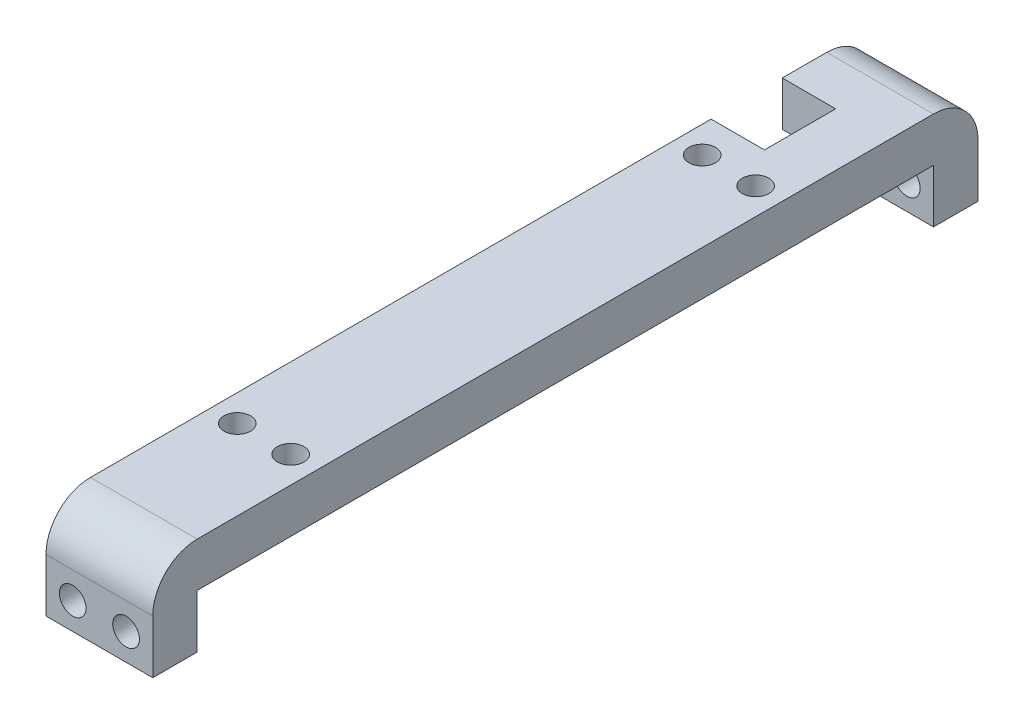
ISO-10303-21;
HEADER;
FILE_DESCRIPTION(('STEP AP214'),'2;1');
FILE_NAME('part.step','',(''),(''),'','','');
FILE_SCHEMA(('AUTOMOTIVE_DESIGN { 1 0 10303 214 1 1 1 1 }'));
ENDSEC;
DATA;
#1=APPLICATION_CONTEXT('core data for automotive mechanical design processes');
#2=APPLICATION_PROTOCOL_DEFINITION('international standard','automotive_design',2000,#1);
#3=PRODUCT_CONTEXT('',#1,'mechanical');
#4=PRODUCT('Part','Part','',(#3));
#5=PRODUCT_RELATED_PRODUCT_CATEGORY('part','',(#4));
#6=PRODUCT_DEFINITION_FORMATION('','',#4);
#7=PRODUCT_DEFINITION_CONTEXT('part definition',#1,'design');
#8=PRODUCT_DEFINITION('design','',#6,#7);
#9=PRODUCT_DEFINITION_SHAPE('','',#8);
#10=(LENGTH_UNIT() NAMED_UNIT(*) SI_UNIT(.MILLI.,.METRE.));
#11=(NAMED_UNIT(*) PLANE_ANGLE_UNIT() SI_UNIT($,.RADIAN.));
#12=(NAMED_UNIT(*) SI_UNIT($,.STERADIAN.) SOLID_ANGLE_UNIT());
#13=UNCERTAINTY_MEASURE_WITH_UNIT(LENGTH_MEASURE(1.E-05),#10,'distance_accuracy_value','');
#14=(GEOMETRIC_REPRESENTATION_CONTEXT(3) GLOBAL_UNCERTAINTY_ASSIGNED_CONTEXT((#13)) GLOBAL_UNIT_ASSIGNED_CONTEXT((#10,
#11,#12)) REPRESENTATION_CONTEXT('',''));
#15=CARTESIAN_POINT('',(0.,0.,0.));
#16=DIRECTION('',(0.,0.,1.));
#17=DIRECTION('',(1.,0.,0.));
#18=AXIS2_PLACEMENT_3D('',#15,#16,#17);
#19=CARTESIAN_POINT('',(-6.,5.5,5.));
#20=DIRECTION('',(1.,0.,0.));
#21=DIRECTION('',(0.,1.,0.));
#22=AXIS2_PLACEMENT_3D('',#19,#20,#21);
#23=PLANE('',#22);
#24=DIRECTION('',(0.,0.,-1.));
#25=VECTOR('',#24,1.);
#26=CARTESIAN_POINT('',(-6.,5.5,5.));
#27=LINE('',#26,#25);
#28=CARTESIAN_POINT('',(-6.,5.5,9.99999999999999));
#29=VERTEX_POINT('',#28);
#30=CARTESIAN_POINT('',(-6.,5.5,5.));
#31=VERTEX_POINT('',#30);
#32=EDGE_CURVE('E143',#29,#31,#27,.T.);
#33=ORIENTED_EDGE('',*,*,#32,.T.);
#34=CARTESIAN_POINT('',(-6.,0.5,5.));
#35=DIRECTION('',(1.,0.,0.));
#36=DIRECTION('',(0.,1.,0.));
#37=AXIS2_PLACEMENT_3D('',#34,#35,#36);
#38=CIRCLE('',#37,5.);
#39=CARTESIAN_POINT('',(-6.,0.5,0.));
#40=VERTEX_POINT('',#39);
#41=EDGE_CURVE('E40',#31,#40,#38,.F.);
#42=ORIENTED_EDGE('',*,*,#41,.T.);
#43=DIRECTION('',(0.,-1.,0.));
#44=VECTOR('',#43,1.);
#45=CARTESIAN_POINT('',(-6.,5.5,0.));
#46=LINE('',#45,#44);
#47=CARTESIAN_POINT('',(-6.,-5.5,0.));
#48=VERTEX_POINT('',#47);
#49=EDGE_CURVE('E271',#40,#48,#46,.T.);
#50=ORIENTED_EDGE('',*,*,#49,.T.);
#51=DIRECTION('',(0.,0.,-1.));
#52=VECTOR('',#51,1.);
#53=CARTESIAN_POINT('',(-6.,-5.5,5.));
#54=LINE('',#53,#52);
#55=CARTESIAN_POINT('',(-6.,-5.5,5.));
#56=VERTEX_POINT('',#55);
#57=EDGE_CURVE('E259',#56,#48,#54,.T.);
#58=ORIENTED_EDGE('',*,*,#57,.F.);
#59=DIRECTION('',(0.,-1.,0.));
#60=VECTOR('',#59,1.);
#61=CARTESIAN_POINT('',(-6.,5.5,5.));
#62=LINE('',#61,#60);
#63=CARTESIAN_POINT('',(-6.,0.5,5.));
#64=VERTEX_POINT('',#63);
#65=EDGE_CURVE('E256',#64,#56,#62,.T.);
#66=ORIENTED_EDGE('',*,*,#65,.F.);
#67=DIRECTION('',(0.,0.,-1.));
#68=VECTOR('',#67,1.);
#69=CARTESIAN_POINT('',(-6.,0.5,87.76));
#70=LINE('',#69,#68);
#71=CARTESIAN_POINT('',(-6.,0.499999999999999,9.99999999999999));
#72=VERTEX_POINT('',#71);
#73=EDGE_CURVE('E276',#72,#64,#70,.T.);
#74=ORIENTED_EDGE('',*,*,#73,.F.);
#75=DIRECTION('',(0.,1.,0.));
#76=VECTOR('',#75,1.);
#77=CARTESIAN_POINT('',(-6.,-9.5,9.99999999999999));
#78=LINE('',#77,#76);
#79=EDGE_CURVE('E170',#72,#29,#78,.T.);
#80=ORIENTED_EDGE('',*,*,#79,.T.);
#81=EDGE_LOOP('',(#33,#42,#50,#58,#66,#74,#80));
#82=FACE_BOUND('',#81,.T.);
#83=ADVANCED_FACE('F32',(#82),#23,.F.);
#84=DIRECTION('',(0.,-1.,0.));
#85=VECTOR('',#84,1.);
#86=CARTESIAN_POINT('',(-6.,5.5,92.76));
#87=LINE('',#86,#85);
#88=CARTESIAN_POINT('',(-6.,0.5,92.76));
#89=VERTEX_POINT('',#88);
#90=CARTESIAN_POINT('',(-6.,-5.5,92.76));
#91=VERTEX_POINT('',#90);
#92=EDGE_CURVE('E203',#89,#91,#87,.T.);
#93=ORIENTED_EDGE('',*,*,#92,.F.);
#94=CARTESIAN_POINT('',(-6.,0.5,87.76));
#95=DIRECTION('',(1.,0.,0.));
#96=DIRECTION('',(0.,1.,0.));
#97=AXIS2_PLACEMENT_3D('',#94,#95,#96);
#98=CIRCLE('',#97,5.);
#99=CARTESIAN_POINT('',(-6.,5.5,87.76));
#100=VERTEX_POINT('',#99);
#101=EDGE_CURVE('E138',#89,#100,#98,.F.);
#102=ORIENTED_EDGE('',*,*,#101,.T.);
#103=CARTESIAN_POINT('',(-6.,5.5,18.));
#104=VERTEX_POINT('',#103);
#105=EDGE_CURVE('E131',#100,#104,#27,.T.);
#106=ORIENTED_EDGE('',*,*,#105,.T.);
#107=DIRECTION('',(0.,1.,0.));
#108=VECTOR('',#107,1.);
#109=CARTESIAN_POINT('',(-6.,-9.5,18.));
#110=LINE('',#109,#108);
#111=CARTESIAN_POINT('',(-6.,0.499999999999999,18.));
#112=VERTEX_POINT('',#111);
#113=EDGE_CURVE('E136',#112,#104,#110,.T.);
#114=ORIENTED_EDGE('',*,*,#113,.F.);
#115=CARTESIAN_POINT('',(-6.,0.5,87.76));
#116=VERTEX_POINT('',#115);
#117=EDGE_CURVE('E272',#116,#112,#70,.T.);
#118=ORIENTED_EDGE('',*,*,#117,.F.);
#119=DIRECTION('',(0.,-1.,0.));
#120=VECTOR('',#119,1.);
#121=CARTESIAN_POINT('',(-6.,5.5,87.76));
#122=LINE('',#121,#120);
#123=CARTESIAN_POINT('',(-6.,-5.5,87.76));
#124=VERTEX_POINT('',#123);
#125=EDGE_CURVE('E202',#116,#124,#122,.T.);
#126=ORIENTED_EDGE('',*,*,#125,.T.);
#127=DIRECTION('',(0.,0.,-1.));
#128=VECTOR('',#127,1.);
#129=CARTESIAN_POINT('',(-6.,-5.5,92.76));
#130=LINE('',#129,#128);
#131=EDGE_CURVE('E219',#91,#124,#130,.T.);
#132=ORIENTED_EDGE('',*,*,#131,.F.);
#133=EDGE_LOOP('',(#93,#102,#106,#114,#118,#126,#132));
#134=FACE_BOUND('',#133,.T.);
#135=ADVANCED_FACE('F134',(#134),#23,.F.);
#136=CARTESIAN_POINT('',(-6.,-5.5,5.));
#137=DIRECTION('',(0.,1.,0.));
#138=DIRECTION('',(0.,0.,1.));
#139=AXIS2_PLACEMENT_3D('',#136,#137,#138);
#140=PLANE('',#139);
#141=DIRECTION('',(1.,0.,0.));
#142=VECTOR('',#141,1.);
#143=CARTESIAN_POINT('',(-6.,-5.5,0.));
#144=LINE('',#143,#142);
#145=CARTESIAN_POINT('',(6.,-5.5,0.));
#146=VERTEX_POINT('',#145);
#147=EDGE_CURVE('E269',#48,#146,#144,.T.);
#148=ORIENTED_EDGE('',*,*,#147,.T.);
#149=DIRECTION('',(0.,0.,-1.));
#150=VECTOR('',#149,1.);
#151=CARTESIAN_POINT('',(6.,-5.5,5.));
#152=LINE('',#151,#150);
#153=CARTESIAN_POINT('',(6.,-5.5,5.));
#154=VERTEX_POINT('',#153);
#155=EDGE_CURVE('E263',#154,#146,#152,.T.);
#156=ORIENTED_EDGE('',*,*,#155,.F.);
#157=DIRECTION('',(1.,0.,0.));
#158=VECTOR('',#157,1.);
#159=CARTESIAN_POINT('',(-6.,-5.5,5.));
#160=LINE('',#159,#158);
#161=EDGE_CURVE('E255',#56,#154,#160,.T.);
#162=ORIENTED_EDGE('',*,*,#161,.F.);
#163=ORIENTED_EDGE('',*,*,#57,.T.);
#164=EDGE_LOOP('',(#148,#156,#162,#163));
#165=FACE_BOUND('',#164,.T.);
#166=ADVANCED_FACE('F312',(#165),#140,.F.);
#167=CARTESIAN_POINT('',(6.,5.5,5.));
#168=DIRECTION('',(-1.,0.,0.));
#169=DIRECTION('',(0.,0.,1.));
#170=AXIS2_PLACEMENT_3D('',#167,#168,#169);
#171=PLANE('',#170);
#172=DIRECTION('',(0.,0.,-1.));
#173=VECTOR('',#172,1.);
#174=CARTESIAN_POINT('',(6.,5.5,5.));
#175=LINE('',#174,#173);
#176=CARTESIAN_POINT('',(6.,5.5,87.76));
#177=VERTEX_POINT('',#176);
#178=CARTESIAN_POINT('',(6.,5.5,5.));
#179=VERTEX_POINT('',#178);
#180=EDGE_CURVE('E142',#177,#179,#175,.T.);
#181=ORIENTED_EDGE('',*,*,#180,.F.);
#182=CARTESIAN_POINT('',(6.,0.5,87.76));
#183=DIRECTION('',(-1.,0.,0.));
#184=DIRECTION('',(0.,0.,1.));
#185=AXIS2_PLACEMENT_3D('',#182,#183,#184);
#186=CIRCLE('',#185,5.);
#187=CARTESIAN_POINT('',(6.,0.5,92.76));
#188=VERTEX_POINT('',#187);
#189=EDGE_CURVE('E294',#177,#188,#186,.F.);
#190=ORIENTED_EDGE('',*,*,#189,.T.);
#191=DIRECTION('',(0.,1.,0.));
#192=VECTOR('',#191,1.);
#193=CARTESIAN_POINT('',(6.,5.5,92.76));
#194=LINE('',#193,#192);
#195=CARTESIAN_POINT('',(6.,-5.5,92.76));
#196=VERTEX_POINT('',#195);
#197=EDGE_CURVE('E208',#196,#188,#194,.T.);
#198=ORIENTED_EDGE('',*,*,#197,.F.);
#199=DIRECTION('',(0.,0.,-1.));
#200=VECTOR('',#199,1.);
#201=CARTESIAN_POINT('',(6.,-5.5,92.76));
#202=LINE('',#201,#200);
#203=CARTESIAN_POINT('',(6.,-5.5,87.76));
#204=VERTEX_POINT('',#203);
#205=EDGE_CURVE('E211',#196,#204,#202,.T.);
#206=ORIENTED_EDGE('',*,*,#205,.T.);
#207=DIRECTION('',(0.,1.,0.));
#208=VECTOR('',#207,1.);
#209=CARTESIAN_POINT('',(6.,5.5,87.76));
#210=LINE('',#209,#208);
#211=CARTESIAN_POINT('',(6.,0.5,87.76));
#212=VERTEX_POINT('',#211);
#213=EDGE_CURVE('E206',#204,#212,#210,.T.);
#214=ORIENTED_EDGE('',*,*,#213,.T.);
#215=DIRECTION('',(0.,0.,-1.));
#216=VECTOR('',#215,1.);
#217=CARTESIAN_POINT('',(6.,0.5,87.76));
#218=LINE('',#217,#216);
#219=CARTESIAN_POINT('',(6.,0.5,5.));
#220=VERTEX_POINT('',#219);
#221=EDGE_CURVE('E243',#212,#220,#218,.T.);
#222=ORIENTED_EDGE('',*,*,#221,.T.);
#223=DIRECTION('',(0.,1.,0.));
#224=VECTOR('',#223,1.);
#225=CARTESIAN_POINT('',(6.,5.5,5.));
#226=LINE('',#225,#224);
#227=EDGE_CURVE('E247',#154,#220,#226,.T.);
#228=ORIENTED_EDGE('',*,*,#227,.F.);
#229=ORIENTED_EDGE('',*,*,#155,.T.);
#230=DIRECTION('',(0.,1.,0.));
#231=VECTOR('',#230,1.);
#232=CARTESIAN_POINT('',(6.,5.5,0.));
#233=LINE('',#232,#231);
#234=CARTESIAN_POINT('',(6.,0.5,0.));
#235=VERTEX_POINT('',#234);
#236=EDGE_CURVE('E258',#146,#235,#233,.T.);
#237=ORIENTED_EDGE('',*,*,#236,.T.);
#238=CARTESIAN_POINT('',(6.,0.5,5.));
#239=DIRECTION('',(-1.,0.,0.));
#240=DIRECTION('',(0.,0.,1.));
#241=AXIS2_PLACEMENT_3D('',#238,#239,#240);
#242=CIRCLE('',#241,5.);
#243=EDGE_CURVE('E292',#235,#179,#242,.F.);
#244=ORIENTED_EDGE('',*,*,#243,.T.);
#245=EDGE_LOOP('',(#181,#190,#198,#206,#214,#222,#228,#229,#237,#244));
#246=FACE_BOUND('',#245,.T.);
#247=ADVANCED_FACE('F297',(#246),#171,.F.);
#248=CARTESIAN_POINT('',(-6.,5.5,5.));
#249=DIRECTION('',(0.,-1.,0.));
#250=DIRECTION('',(0.,0.,-1.));
#251=AXIS2_PLACEMENT_3D('',#248,#249,#250);
#252=PLANE('',#251);
#253=CARTESIAN_POINT('',(-3.,5.5,74.26));
#254=DIRECTION('',(0.,1.,0.));
#255=DIRECTION('',(0.,0.,1.));
#256=AXIS2_PLACEMENT_3D('',#253,#254,#255);
#257=CIRCLE('',#256,1.5);
#258=CARTESIAN_POINT('',(-3.,5.5,75.76));
#259=VERTEX_POINT('',#258);
#260=EDGE_CURVE('E560',#259,#259,#257,.T.);
#261=ORIENTED_EDGE('',*,*,#260,.F.);
#262=EDGE_LOOP('',(#261));
#263=FACE_BOUND('',#262,.T.);
#264=CARTESIAN_POINT('',(3.,5.5,74.26));
#265=DIRECTION('',(0.,1.,0.));
#266=DIRECTION('',(0.,0.,1.));
#267=AXIS2_PLACEMENT_3D('',#264,#265,#266);
#268=CIRCLE('',#267,1.5);
#269=CARTESIAN_POINT('',(3.,5.5,75.76));
#270=VERTEX_POINT('',#269);
#271=EDGE_CURVE('E564',#270,#270,#268,.T.);
#272=ORIENTED_EDGE('',*,*,#271,.F.);
#273=EDGE_LOOP('',(#272));
#274=FACE_BOUND('',#273,.T.);
#275=CARTESIAN_POINT('',(3.,5.5,22.));
#276=DIRECTION('',(0.,1.,0.));
#277=DIRECTION('',(0.,0.,1.));
#278=AXIS2_PLACEMENT_3D('',#275,#276,#277);
#279=CIRCLE('',#278,1.5);
#280=CARTESIAN_POINT('',(3.,5.5,23.5));
#281=VERTEX_POINT('',#280);
#282=EDGE_CURVE('E568',#281,#281,#279,.T.);
#283=ORIENTED_EDGE('',*,*,#282,.F.);
#284=EDGE_LOOP('',(#283));
#285=FACE_BOUND('',#284,.T.);
#286=CARTESIAN_POINT('',(-3.,5.5,22.));
#287=DIRECTION('',(0.,1.,0.));
#288=DIRECTION('',(0.,0.,1.));
#289=AXIS2_PLACEMENT_3D('',#286,#287,#288);
#290=CIRCLE('',#289,1.5);
#291=CARTESIAN_POINT('',(-3.,5.5,23.5));
#292=VERTEX_POINT('',#291);
#293=EDGE_CURVE('E163',#292,#292,#290,.T.);
#294=ORIENTED_EDGE('',*,*,#293,.F.);
#295=EDGE_LOOP('',(#294));
#296=FACE_BOUND('',#295,.T.);
#297=ORIENTED_EDGE('',*,*,#105,.F.);
#298=DIRECTION('',(-1.,0.,0.));
#299=VECTOR('',#298,1.);
#300=CARTESIAN_POINT('',(6.,5.5,87.76));
#301=LINE('',#300,#299);
#302=EDGE_CURVE('E290',#100,#177,#301,.F.);
#303=ORIENTED_EDGE('',*,*,#302,.T.);
#304=ORIENTED_EDGE('',*,*,#180,.T.);
#305=DIRECTION('',(-1.,0.,0.));
#306=VECTOR('',#305,1.);
#307=CARTESIAN_POINT('',(-6.,5.5,5.));
#308=LINE('',#307,#306);
#309=EDGE_CURVE('E287',#179,#31,#308,.T.);
#310=ORIENTED_EDGE('',*,*,#309,.T.);
#311=ORIENTED_EDGE('',*,*,#32,.F.);
#312=DIRECTION('',(-1.,0.,0.));
#313=VECTOR('',#312,1.);
#314=CARTESIAN_POINT('',(-6.,5.5,9.99999999999999));
#315=LINE('',#314,#313);
#316=CARTESIAN_POINT('',(0.,5.5,10.));
#317=VERTEX_POINT('',#316);
#318=EDGE_CURVE('E153',#317,#29,#315,.T.);
#319=ORIENTED_EDGE('',*,*,#318,.F.);
#320=DIRECTION('',(0.,0.,-1.));
#321=VECTOR('',#320,1.);
#322=CARTESIAN_POINT('',(0.,5.5,10.));
#323=LINE('',#322,#321);
#324=CARTESIAN_POINT('',(0.,5.5,18.));
#325=VERTEX_POINT('',#324);
#326=EDGE_CURVE('E158',#325,#317,#323,.T.);
#327=ORIENTED_EDGE('',*,*,#326,.F.);
#328=DIRECTION('',(1.,0.,0.));
#329=VECTOR('',#328,1.);
#330=CARTESIAN_POINT('',(-6.,5.5,18.));
#331=LINE('',#330,#329);
#332=EDGE_CURVE('E148',#104,#325,#331,.T.);
#333=ORIENTED_EDGE('',*,*,#332,.F.);
#334=EDGE_LOOP('',(#297,#303,#304,#310,#311,#319,#327,#333));
#335=FACE_BOUND('',#334,.T.);
#336=ADVANCED_FACE('F155',(#263,#274,#285,#296,#335),#252,.F.);
#337=CARTESIAN_POINT('',(-6.,-5.5,5.));
#338=DIRECTION('',(0.,0.,1.));
#339=DIRECTION('',(1.,0.,0.));
#340=AXIS2_PLACEMENT_3D('',#337,#338,#339);
#341=PLANE('',#340);
#342=CARTESIAN_POINT('',(-3.,-2.5,5.));
#343=DIRECTION('',(0.,0.,1.));
#344=DIRECTION('',(1.,0.,0.));
#345=AXIS2_PLACEMENT_3D('',#342,#343,#344);
#346=CIRCLE('',#345,1.5);
#347=CARTESIAN_POINT('',(-1.5,-2.5,5.));
#348=VERTEX_POINT('',#347);
#349=EDGE_CURVE('E187',#348,#348,#346,.T.);
#350=ORIENTED_EDGE('',*,*,#349,.F.);
#351=EDGE_LOOP('',(#350));
#352=FACE_BOUND('',#351,.T.);
#353=CARTESIAN_POINT('',(3.,-2.5,5.));
#354=DIRECTION('',(0.,0.,1.));
#355=DIRECTION('',(1.,0.,0.));
#356=AXIS2_PLACEMENT_3D('',#353,#354,#355);
#357=CIRCLE('',#356,1.5);
#358=CARTESIAN_POINT('',(4.5,-2.5,5.));
#359=VERTEX_POINT('',#358);
#360=EDGE_CURVE('E199',#359,#359,#357,.T.);
#361=ORIENTED_EDGE('',*,*,#360,.F.);
#362=EDGE_LOOP('',(#361));
#363=FACE_BOUND('',#362,.T.);
#364=DIRECTION('',(1.,0.,0.));
#365=VECTOR('',#364,1.);
#366=CARTESIAN_POINT('',(-6.,0.5,5.));
#367=LINE('',#366,#365);
#368=EDGE_CURVE('E232',#64,#220,#367,.T.);
#369=ORIENTED_EDGE('',*,*,#368,.F.);
#370=ORIENTED_EDGE('',*,*,#65,.T.);
#371=ORIENTED_EDGE('',*,*,#161,.T.);
#372=ORIENTED_EDGE('',*,*,#227,.T.);
#373=EDGE_LOOP('',(#369,#370,#371,#372));
#374=FACE_BOUND('',#373,.T.);
#375=ADVANCED_FACE('F316',(#352,#363,#374),#341,.T.);
#376=CARTESIAN_POINT('',(-6.,-5.5,0.));
#377=DIRECTION('',(0.,0.,1.));
#378=DIRECTION('',(1.,0.,0.));
#379=AXIS2_PLACEMENT_3D('',#376,#377,#378);
#380=PLANE('',#379);
#381=CARTESIAN_POINT('',(-3.,-2.5,0.));
#382=DIRECTION('',(0.,0.,-1.));
#383=DIRECTION('',(-1.,0.,0.));
#384=AXIS2_PLACEMENT_3D('',#381,#382,#383);
#385=CIRCLE('',#384,1.5);
#386=CARTESIAN_POINT('',(-4.5,-2.5,0.));
#387=VERTEX_POINT('',#386);
#388=EDGE_CURVE('E178',#387,#387,#385,.T.);
#389=ORIENTED_EDGE('',*,*,#388,.F.);
#390=EDGE_LOOP('',(#389));
#391=FACE_BOUND('',#390,.T.);
#392=CARTESIAN_POINT('',(3.,-2.5,0.));
#393=DIRECTION('',(0.,0.,-1.));
#394=DIRECTION('',(-1.,0.,0.));
#395=AXIS2_PLACEMENT_3D('',#392,#393,#394);
#396=CIRCLE('',#395,1.5);
#397=CARTESIAN_POINT('',(1.5,-2.5,0.));
#398=VERTEX_POINT('',#397);
#399=EDGE_CURVE('E190',#398,#398,#396,.T.);
#400=ORIENTED_EDGE('',*,*,#399,.F.);
#401=EDGE_LOOP('',(#400));
#402=FACE_BOUND('',#401,.T.);
#403=ORIENTED_EDGE('',*,*,#49,.F.);
#404=DIRECTION('',(-1.,0.,0.));
#405=VECTOR('',#404,1.);
#406=CARTESIAN_POINT('',(-6.,0.5,0.));
#407=LINE('',#406,#405);
#408=EDGE_CURVE('E11',#40,#235,#407,.F.);
#409=ORIENTED_EDGE('',*,*,#408,.T.);
#410=ORIENTED_EDGE('',*,*,#236,.F.);
#411=ORIENTED_EDGE('',*,*,#147,.F.);
#412=EDGE_LOOP('',(#403,#409,#410,#411));
#413=FACE_BOUND('',#412,.T.);
#414=ADVANCED_FACE('F309',(#391,#402,#413),#380,.F.);
#415=CARTESIAN_POINT('',(-6.,0.5,87.76));
#416=DIRECTION('',(0.,1.,0.));
#417=DIRECTION('',(0.,0.,1.));
#418=AXIS2_PLACEMENT_3D('',#415,#416,#417);
#419=PLANE('',#418);
#420=CARTESIAN_POINT('',(-3.,0.5,74.26));
#421=DIRECTION('',(0.,1.,0.));
#422=DIRECTION('',(0.,0.,1.));
#423=AXIS2_PLACEMENT_3D('',#420,#421,#422);
#424=CIRCLE('',#423,1.5);
#425=CARTESIAN_POINT('',(-3.,0.5,75.76));
#426=VERTEX_POINT('',#425);
#427=EDGE_CURVE('E582',#426,#426,#424,.F.);
#428=ORIENTED_EDGE('',*,*,#427,.F.);
#429=EDGE_LOOP('',(#428));
#430=FACE_BOUND('',#429,.T.);
#431=CARTESIAN_POINT('',(3.,0.5,74.26));
#432=DIRECTION('',(0.,1.,0.));
#433=DIRECTION('',(0.,0.,1.));
#434=AXIS2_PLACEMENT_3D('',#431,#432,#433);
#435=CIRCLE('',#434,1.5);
#436=CARTESIAN_POINT('',(3.,0.5,75.76));
#437=VERTEX_POINT('',#436);
#438=EDGE_CURVE('E578',#437,#437,#435,.F.);
#439=ORIENTED_EDGE('',*,*,#438,.F.);
#440=EDGE_LOOP('',(#439));
#441=FACE_BOUND('',#440,.T.);
#442=CARTESIAN_POINT('',(3.,0.5,22.));
#443=DIRECTION('',(0.,1.,0.));
#444=DIRECTION('',(0.,0.,1.));
#445=AXIS2_PLACEMENT_3D('',#442,#443,#444);
#446=CIRCLE('',#445,1.5);
#447=CARTESIAN_POINT('',(3.,0.5,23.5));
#448=VERTEX_POINT('',#447);
#449=EDGE_CURVE('E572',#448,#448,#446,.F.);
#450=ORIENTED_EDGE('',*,*,#449,.F.);
#451=EDGE_LOOP('',(#450));
#452=FACE_BOUND('',#451,.T.);
#453=CARTESIAN_POINT('',(-3.,0.5,22.));
#454=DIRECTION('',(0.,1.,0.));
#455=DIRECTION('',(0.,0.,1.));
#456=AXIS2_PLACEMENT_3D('',#453,#454,#455);
#457=CIRCLE('',#456,1.5);
#458=CARTESIAN_POINT('',(-3.,0.5,23.5));
#459=VERTEX_POINT('',#458);
#460=EDGE_CURVE('E159',#459,#459,#457,.F.);
#461=ORIENTED_EDGE('',*,*,#460,.F.);
#462=EDGE_LOOP('',(#461));
#463=FACE_BOUND('',#462,.T.);
#464=DIRECTION('',(0.,0.,1.));
#465=VECTOR('',#464,1.);
#466=CARTESIAN_POINT('',(0.,0.499999999999999,10.));
#467=LINE('',#466,#465);
#468=CARTESIAN_POINT('',(0.,0.499999999999999,10.));
#469=VERTEX_POINT('',#468);
#470=CARTESIAN_POINT('',(0.,0.5,18.));
#471=VERTEX_POINT('',#470);
#472=EDGE_CURVE('E173',#469,#471,#467,.T.);
#473=ORIENTED_EDGE('',*,*,#472,.F.);
#474=DIRECTION('',(1.,0.,0.));
#475=VECTOR('',#474,1.);
#476=CARTESIAN_POINT('',(-6.,0.499999999999999,9.99999999999999));
#477=LINE('',#476,#475);
#478=EDGE_CURVE('E166',#72,#469,#477,.T.);
#479=ORIENTED_EDGE('',*,*,#478,.F.);
#480=ORIENTED_EDGE('',*,*,#73,.T.);
#481=ORIENTED_EDGE('',*,*,#368,.T.);
#482=ORIENTED_EDGE('',*,*,#221,.F.);
#483=DIRECTION('',(1.,0.,0.));
#484=VECTOR('',#483,1.);
#485=CARTESIAN_POINT('',(-6.,0.5,87.76));
#486=LINE('',#485,#484);
#487=EDGE_CURVE('E237',#116,#212,#486,.T.);
#488=ORIENTED_EDGE('',*,*,#487,.F.);
#489=ORIENTED_EDGE('',*,*,#117,.T.);
#490=DIRECTION('',(-1.,0.,0.));
#491=VECTOR('',#490,1.);
#492=CARTESIAN_POINT('',(-6.,0.499999999999999,18.));
#493=LINE('',#492,#491);
#494=EDGE_CURVE('E151',#471,#112,#493,.T.);
#495=ORIENTED_EDGE('',*,*,#494,.F.);
#496=EDGE_LOOP('',(#473,#479,#480,#481,#482,#488,#489,#495));
#497=FACE_BOUND('',#496,.T.);
#498=ADVANCED_FACE('F325',(#430,#441,#452,#463,#497),#419,.F.);
#499=CARTESIAN_POINT('',(-6.,-5.5,87.76));
#500=DIRECTION('',(0.,0.,1.));
#501=DIRECTION('',(1.,0.,0.));
#502=AXIS2_PLACEMENT_3D('',#499,#500,#501);
#503=PLANE('',#502);
#504=CARTESIAN_POINT('',(-3.,-2.5,87.76));
#505=DIRECTION('',(0.,0.,1.));
#506=DIRECTION('',(1.,0.,0.));
#507=AXIS2_PLACEMENT_3D('',#504,#505,#506);
#508=CIRCLE('',#507,1.5);
#509=CARTESIAN_POINT('',(-1.5,-2.5,87.76));
#510=VERTEX_POINT('',#509);
#511=EDGE_CURVE('E184',#510,#510,#508,.T.);
#512=ORIENTED_EDGE('',*,*,#511,.T.);
#513=EDGE_LOOP('',(#512));
#514=FACE_BOUND('',#513,.T.);
#515=CARTESIAN_POINT('',(3.,-2.5,87.76));
#516=DIRECTION('',(0.,0.,1.));
#517=DIRECTION('',(1.,0.,0.));
#518=AXIS2_PLACEMENT_3D('',#515,#516,#517);
#519=CIRCLE('',#518,1.5);
#520=CARTESIAN_POINT('',(4.5,-2.5,87.76));
#521=VERTEX_POINT('',#520);
#522=EDGE_CURVE('E196',#521,#521,#519,.T.);
#523=ORIENTED_EDGE('',*,*,#522,.T.);
#524=EDGE_LOOP('',(#523));
#525=FACE_BOUND('',#524,.T.);
#526=ORIENTED_EDGE('',*,*,#125,.F.);
#527=ORIENTED_EDGE('',*,*,#487,.T.);
#528=ORIENTED_EDGE('',*,*,#213,.F.);
#529=DIRECTION('',(1.,0.,0.));
#530=VECTOR('',#529,1.);
#531=CARTESIAN_POINT('',(-6.,-5.5,87.76));
#532=LINE('',#531,#530);
#533=EDGE_CURVE('E214',#124,#204,#532,.T.);
#534=ORIENTED_EDGE('',*,*,#533,.F.);
#535=EDGE_LOOP('',(#526,#527,#528,#534));
#536=FACE_BOUND('',#535,.T.);
#537=ADVANCED_FACE('F327',(#514,#525,#536),#503,.F.);
#538=CARTESIAN_POINT('',(-6.,-5.5,92.76));
#539=DIRECTION('',(0.,1.,0.));
#540=DIRECTION('',(0.,0.,1.));
#541=AXIS2_PLACEMENT_3D('',#538,#539,#540);
#542=PLANE('',#541);
#543=ORIENTED_EDGE('',*,*,#533,.T.);
#544=ORIENTED_EDGE('',*,*,#205,.F.);
#545=DIRECTION('',(1.,0.,0.));
#546=VECTOR('',#545,1.);
#547=CARTESIAN_POINT('',(-6.,-5.5,92.76));
#548=LINE('',#547,#546);
#549=EDGE_CURVE('E205',#91,#196,#548,.T.);
#550=ORIENTED_EDGE('',*,*,#549,.F.);
#551=ORIENTED_EDGE('',*,*,#131,.T.);
#552=EDGE_LOOP('',(#543,#544,#550,#551));
#553=FACE_BOUND('',#552,.T.);
#554=ADVANCED_FACE('F334',(#553),#542,.F.);
#555=CARTESIAN_POINT('',(-6.,-5.5,92.76));
#556=DIRECTION('',(0.,0.,1.));
#557=DIRECTION('',(1.,0.,0.));
#558=AXIS2_PLACEMENT_3D('',#555,#556,#557);
#559=PLANE('',#558);
#560=CARTESIAN_POINT('',(-3.,-2.5,92.76));
#561=DIRECTION('',(0.,0.,1.));
#562=DIRECTION('',(1.,0.,0.));
#563=AXIS2_PLACEMENT_3D('',#560,#561,#562);
#564=CIRCLE('',#563,1.5);
#565=CARTESIAN_POINT('',(-1.5,-2.5,92.76));
#566=VERTEX_POINT('',#565);
#567=EDGE_CURVE('E181',#566,#566,#564,.F.);
#568=ORIENTED_EDGE('',*,*,#567,.T.);
#569=EDGE_LOOP('',(#568));
#570=FACE_BOUND('',#569,.T.);
#571=CARTESIAN_POINT('',(3.,-2.5,92.76));
#572=DIRECTION('',(0.,0.,1.));
#573=DIRECTION('',(1.,0.,0.));
#574=AXIS2_PLACEMENT_3D('',#571,#572,#573);
#575=CIRCLE('',#574,1.5);
#576=CARTESIAN_POINT('',(4.5,-2.5,92.76));
#577=VERTEX_POINT('',#576);
#578=EDGE_CURVE('E193',#577,#577,#575,.F.);
#579=ORIENTED_EDGE('',*,*,#578,.T.);
#580=EDGE_LOOP('',(#579));
#581=FACE_BOUND('',#580,.T.);
#582=ORIENTED_EDGE('',*,*,#197,.T.);
#583=DIRECTION('',(-1.,0.,0.));
#584=VECTOR('',#583,1.);
#585=CARTESIAN_POINT('',(-6.,0.5,92.76));
#586=LINE('',#585,#584);
#587=EDGE_CURVE('E262',#188,#89,#586,.T.);
#588=ORIENTED_EDGE('',*,*,#587,.T.);
#589=ORIENTED_EDGE('',*,*,#92,.T.);
#590=ORIENTED_EDGE('',*,*,#549,.T.);
#591=EDGE_LOOP('',(#582,#588,#589,#590));
#592=FACE_BOUND('',#591,.T.);
#593=ADVANCED_FACE('F301',(#570,#581,#592),#559,.T.);
#594=CARTESIAN_POINT('',(3.,-2.5,97.0026406871193));
#595=DIRECTION('',(0.,0.,-1.));
#596=DIRECTION('',(-1.,0.,0.));
#597=AXIS2_PLACEMENT_3D('',#594,#595,#596);
#598=CYLINDRICAL_SURFACE('',#597,1.5);
#599=ORIENTED_EDGE('',*,*,#578,.F.);
#600=EDGE_LOOP('',(#599));
#601=FACE_BOUND('',#600,.T.);
#602=ORIENTED_EDGE('',*,*,#522,.F.);
#603=EDGE_LOOP('',(#602));
#604=FACE_BOUND('',#603,.T.);
#605=ADVANCED_FACE('F389',(#601,#604),#598,.F.);
#606=ORIENTED_EDGE('',*,*,#360,.T.);
#607=EDGE_LOOP('',(#606));
#608=FACE_BOUND('',#607,.T.);
#609=ORIENTED_EDGE('',*,*,#399,.T.);
#610=EDGE_LOOP('',(#609));
#611=FACE_BOUND('',#610,.T.);
#612=ADVANCED_FACE('F386',(#608,#611),#598,.F.);
#613=CARTESIAN_POINT('',(-3.,-2.5,97.0026406871193));
#614=DIRECTION('',(0.,0.,-1.));
#615=DIRECTION('',(-1.,0.,0.));
#616=AXIS2_PLACEMENT_3D('',#613,#614,#615);
#617=CYLINDRICAL_SURFACE('',#616,1.5);
#618=ORIENTED_EDGE('',*,*,#567,.F.);
#619=EDGE_LOOP('',(#618));
#620=FACE_BOUND('',#619,.T.);
#621=ORIENTED_EDGE('',*,*,#511,.F.);
#622=EDGE_LOOP('',(#621));
#623=FACE_BOUND('',#622,.T.);
#624=ADVANCED_FACE('F384',(#620,#623),#617,.F.);
#625=ORIENTED_EDGE('',*,*,#349,.T.);
#626=EDGE_LOOP('',(#625));
#627=FACE_BOUND('',#626,.T.);
#628=ORIENTED_EDGE('',*,*,#388,.T.);
#629=EDGE_LOOP('',(#628));
#630=FACE_BOUND('',#629,.T.);
#631=ADVANCED_FACE('F377',(#627,#630),#617,.F.);
#632=CARTESIAN_POINT('',(-6.,-9.5,9.99999999999999));
#633=DIRECTION('',(0.,0.,-1.));
#634=DIRECTION('',(-1.,0.,0.));
#635=AXIS2_PLACEMENT_3D('',#632,#633,#634);
#636=PLANE('',#635);
#637=ORIENTED_EDGE('',*,*,#478,.T.);
#638=DIRECTION('',(0.,1.,0.));
#639=VECTOR('',#638,1.);
#640=CARTESIAN_POINT('',(0.,-9.5,10.));
#641=LINE('',#640,#639);
#642=EDGE_CURVE('E174',#469,#317,#641,.T.);
#643=ORIENTED_EDGE('',*,*,#642,.T.);
#644=ORIENTED_EDGE('',*,*,#318,.T.);
#645=ORIENTED_EDGE('',*,*,#79,.F.);
#646=EDGE_LOOP('',(#637,#643,#644,#645));
#647=FACE_BOUND('',#646,.T.);
#648=ADVANCED_FACE('F318',(#647),#636,.F.);
#649=CARTESIAN_POINT('',(0.,-9.5,10.));
#650=DIRECTION('',(1.,0.,0.));
#651=DIRECTION('',(0.,0.,-1.));
#652=AXIS2_PLACEMENT_3D('',#649,#650,#651);
#653=PLANE('',#652);
#654=ORIENTED_EDGE('',*,*,#472,.T.);
#655=DIRECTION('',(0.,1.,0.));
#656=VECTOR('',#655,1.);
#657=CARTESIAN_POINT('',(0.,-9.5,18.));
#658=LINE('',#657,#656);
#659=EDGE_CURVE('E152',#471,#325,#658,.T.);
#660=ORIENTED_EDGE('',*,*,#659,.T.);
#661=ORIENTED_EDGE('',*,*,#326,.T.);
#662=ORIENTED_EDGE('',*,*,#642,.F.);
#663=EDGE_LOOP('',(#654,#660,#661,#662));
#664=FACE_BOUND('',#663,.T.);
#665=ADVANCED_FACE('F324',(#664),#653,.F.);
#666=CARTESIAN_POINT('',(-6.,-9.5,18.));
#667=DIRECTION('',(0.,0.,1.));
#668=DIRECTION('',(1.,0.,0.));
#669=AXIS2_PLACEMENT_3D('',#666,#667,#668);
#670=PLANE('',#669);
#671=ORIENTED_EDGE('',*,*,#494,.T.);
#672=ORIENTED_EDGE('',*,*,#113,.T.);
#673=ORIENTED_EDGE('',*,*,#332,.T.);
#674=ORIENTED_EDGE('',*,*,#659,.F.);
#675=EDGE_LOOP('',(#671,#672,#673,#674));
#676=FACE_BOUND('',#675,.T.);
#677=ADVANCED_FACE('F147',(#676),#670,.F.);
#678=CARTESIAN_POINT('',(-3.,-3.74264068711929,22.));
#679=DIRECTION('',(0.,1.,0.));
#680=DIRECTION('',(0.,0.,1.));
#681=AXIS2_PLACEMENT_3D('',#678,#679,#680);
#682=CYLINDRICAL_SURFACE('',#681,1.5);
#683=ORIENTED_EDGE('',*,*,#460,.T.);
#684=EDGE_LOOP('',(#683));
#685=FACE_BOUND('',#684,.T.);
#686=ORIENTED_EDGE('',*,*,#293,.T.);
#687=EDGE_LOOP('',(#686));
#688=FACE_BOUND('',#687,.T.);
#689=ADVANCED_FACE('F370',(#685,#688),#682,.F.);
#690=CARTESIAN_POINT('',(3.,-3.74264068711929,22.));
#691=DIRECTION('',(0.,1.,0.));
#692=DIRECTION('',(0.,0.,1.));
#693=AXIS2_PLACEMENT_3D('',#690,#691,#692);
#694=CYLINDRICAL_SURFACE('',#693,1.5);
#695=ORIENTED_EDGE('',*,*,#449,.T.);
#696=EDGE_LOOP('',(#695));
#697=FACE_BOUND('',#696,.T.);
#698=ORIENTED_EDGE('',*,*,#282,.T.);
#699=EDGE_LOOP('',(#698));
#700=FACE_BOUND('',#699,.T.);
#701=ADVANCED_FACE('F362',(#697,#700),#694,.F.);
#702=CARTESIAN_POINT('',(3.,-3.74264068711929,74.26));
#703=DIRECTION('',(0.,1.,0.));
#704=DIRECTION('',(0.,0.,1.));
#705=AXIS2_PLACEMENT_3D('',#702,#703,#704);
#706=CYLINDRICAL_SURFACE('',#705,1.5);
#707=ORIENTED_EDGE('',*,*,#438,.T.);
#708=EDGE_LOOP('',(#707));
#709=FACE_BOUND('',#708,.T.);
#710=ORIENTED_EDGE('',*,*,#271,.T.);
#711=EDGE_LOOP('',(#710));
#712=FACE_BOUND('',#711,.T.);
#713=ADVANCED_FACE('F356',(#709,#712),#706,.F.);
#714=CARTESIAN_POINT('',(-3.,-3.74264068711929,74.26));
#715=DIRECTION('',(0.,1.,0.));
#716=DIRECTION('',(0.,0.,1.));
#717=AXIS2_PLACEMENT_3D('',#714,#715,#716);
#718=CYLINDRICAL_SURFACE('',#717,1.5);
#719=ORIENTED_EDGE('',*,*,#427,.T.);
#720=EDGE_LOOP('',(#719));
#721=FACE_BOUND('',#720,.T.);
#722=ORIENTED_EDGE('',*,*,#260,.T.);
#723=EDGE_LOOP('',(#722));
#724=FACE_BOUND('',#723,.T.);
#725=ADVANCED_FACE('F351',(#721,#724),#718,.F.);
#726=CARTESIAN_POINT('',(-6.,0.5,87.76));
#727=DIRECTION('',(1.,0.,0.));
#728=DIRECTION('',(0.,0.,-1.));
#729=AXIS2_PLACEMENT_3D('',#726,#727,#728);
#730=CYLINDRICAL_SURFACE('',#729,5.);
#731=ORIENTED_EDGE('',*,*,#189,.F.);
#732=ORIENTED_EDGE('',*,*,#302,.F.);
#733=ORIENTED_EDGE('',*,*,#101,.F.);
#734=ORIENTED_EDGE('',*,*,#587,.F.);
#735=EDGE_LOOP('',(#731,#732,#733,#734));
#736=FACE_BOUND('',#735,.T.);
#737=ADVANCED_FACE('F302',(#736),#730,.T.);
#738=CARTESIAN_POINT('',(-6.,0.5,5.));
#739=DIRECTION('',(-1.,0.,0.));
#740=DIRECTION('',(0.,0.,1.));
#741=AXIS2_PLACEMENT_3D('',#738,#739,#740);
#742=CYLINDRICAL_SURFACE('',#741,5.);
#743=ORIENTED_EDGE('',*,*,#243,.F.);
#744=ORIENTED_EDGE('',*,*,#408,.F.);
#745=ORIENTED_EDGE('',*,*,#41,.F.);
#746=ORIENTED_EDGE('',*,*,#309,.F.);
#747=EDGE_LOOP('',(#743,#744,#745,#746));
#748=FACE_BOUND('',#747,.T.);
#749=ADVANCED_FACE('F34',(#748),#742,.T.);
#750=CLOSED_SHELL('',(#83,#135,#166,#247,#336,#375,#414,#498,#537,#554,#593,#605,#612,#624,#631,
#648,#665,#677,#689,#701,#713,#725,#737,#749));
#751=MANIFOLD_SOLID_BREP('B2',#750);
#752=ADVANCED_BREP_SHAPE_REPRESENTATION('',(#18,#751),#14);
#753=SHAPE_DEFINITION_REPRESENTATION(#9,#752);
ENDSEC;
END-ISO-10303-21;
